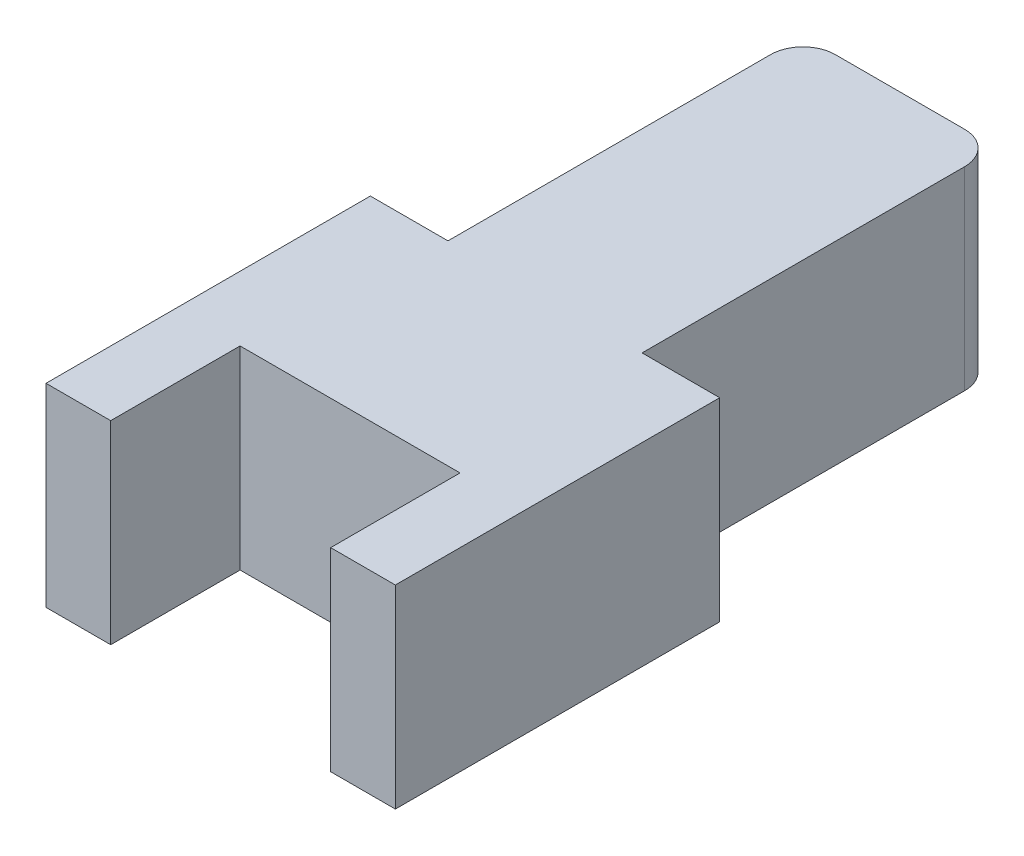
ISO-10303-21;
HEADER;
FILE_DESCRIPTION(('STEP AP214'),'2;1');
FILE_NAME('part.step','',(''),(''),'','','');
FILE_SCHEMA(('AUTOMOTIVE_DESIGN { 1 0 10303 214 1 1 1 1 }'));
ENDSEC;
DATA;
#1=APPLICATION_CONTEXT('core data for automotive mechanical design processes');
#2=APPLICATION_PROTOCOL_DEFINITION('international standard','automotive_design',2000,#1);
#3=PRODUCT_CONTEXT('',#1,'mechanical');
#4=PRODUCT('Part','Part','',(#3));
#5=PRODUCT_RELATED_PRODUCT_CATEGORY('part','',(#4));
#6=PRODUCT_DEFINITION_FORMATION('','',#4);
#7=PRODUCT_DEFINITION_CONTEXT('part definition',#1,'design');
#8=PRODUCT_DEFINITION('design','',#6,#7);
#9=PRODUCT_DEFINITION_SHAPE('','',#8);
#10=(LENGTH_UNIT() NAMED_UNIT(*) SI_UNIT(.MILLI.,.METRE.));
#11=(NAMED_UNIT(*) PLANE_ANGLE_UNIT() SI_UNIT($,.RADIAN.));
#12=(NAMED_UNIT(*) SI_UNIT($,.STERADIAN.) SOLID_ANGLE_UNIT());
#13=UNCERTAINTY_MEASURE_WITH_UNIT(LENGTH_MEASURE(1.E-05),#10,'distance_accuracy_value','');
#14=(GEOMETRIC_REPRESENTATION_CONTEXT(3) GLOBAL_UNCERTAINTY_ASSIGNED_CONTEXT((#13)) GLOBAL_UNIT_ASSIGNED_CONTEXT((#10,
#11,#12)) REPRESENTATION_CONTEXT('',''));
#15=CARTESIAN_POINT('',(0.,0.,0.));
#16=DIRECTION('',(0.,0.,1.));
#17=DIRECTION('',(1.,0.,0.));
#18=AXIS2_PLACEMENT_3D('',#15,#16,#17);
#19=CARTESIAN_POINT('',(15.4,4.94,0.));
#20=DIRECTION('',(1.,0.,0.));
#21=DIRECTION('',(0.,0.,-1.));
#22=AXIS2_PLACEMENT_3D('',#19,#20,#21);
#23=PLANE('',#22);
#24=DIRECTION('',(0.,0.,-1.));
#25=VECTOR('',#24,1.);
#26=CARTESIAN_POINT('',(15.4,7.94,0.));
#27=LINE('',#26,#25);
#28=CARTESIAN_POINT('',(15.4,7.94,-6.1));
#29=VERTEX_POINT('',#28);
#30=CARTESIAN_POINT('',(15.4,7.94,-11.113558159164));
#31=VERTEX_POINT('',#30);
#32=EDGE_CURVE('E161',#29,#31,#27,.T.);
#33=ORIENTED_EDGE('',*,*,#32,.T.);
#34=DIRECTION('',(0.,1.,0.));
#35=VECTOR('',#34,1.);
#36=CARTESIAN_POINT('',(15.4,4.94,-11.113558159164));
#37=LINE('',#36,#35);
#38=CARTESIAN_POINT('',(15.4,4.94,-11.113558159164));
#39=VERTEX_POINT('',#38);
#40=EDGE_CURVE('E142',#39,#31,#37,.T.);
#41=ORIENTED_EDGE('',*,*,#40,.F.);
#42=DIRECTION('',(0.,0.,-1.));
#43=VECTOR('',#42,1.);
#44=CARTESIAN_POINT('',(15.4,4.94,0.));
#45=LINE('',#44,#43);
#46=CARTESIAN_POINT('',(15.4,4.94,-6.1));
#47=VERTEX_POINT('',#46);
#48=EDGE_CURVE('E148',#47,#39,#45,.T.);
#49=ORIENTED_EDGE('',*,*,#48,.F.);
#50=DIRECTION('',(0.,1.,0.));
#51=VECTOR('',#50,1.);
#52=CARTESIAN_POINT('',(15.4,4.94,-6.1));
#53=LINE('',#52,#51);
#54=EDGE_CURVE('E226',#47,#29,#53,.T.);
#55=ORIENTED_EDGE('',*,*,#54,.T.);
#56=EDGE_LOOP('',(#33,#41,#49,#55));
#57=FACE_BOUND('',#56,.T.);
#58=ADVANCED_FACE('F34',(#57),#23,.F.);
#59=CARTESIAN_POINT('',(0.,4.94,-11.113558159164));
#60=DIRECTION('',(0.,0.,1.));
#61=DIRECTION('',(1.,0.,0.));
#62=AXIS2_PLACEMENT_3D('',#59,#60,#61);
#63=PLANE('',#62);
#64=DIRECTION('',(1.,0.,0.));
#65=VECTOR('',#64,1.);
#66=CARTESIAN_POINT('',(0.,7.94,-11.113558159164));
#67=LINE('',#66,#65);
#68=CARTESIAN_POINT('',(16.6,7.94,-11.113558159164));
#69=VERTEX_POINT('',#68);
#70=EDGE_CURVE('E205',#31,#69,#67,.T.);
#71=ORIENTED_EDGE('',*,*,#70,.T.);
#72=DIRECTION('',(0.,1.,0.));
#73=VECTOR('',#72,1.);
#74=CARTESIAN_POINT('',(16.6,4.94,-11.113558159164));
#75=LINE('',#74,#73);
#76=CARTESIAN_POINT('',(16.6,4.94,-11.113558159164));
#77=VERTEX_POINT('',#76);
#78=EDGE_CURVE('E145',#77,#69,#75,.T.);
#79=ORIENTED_EDGE('',*,*,#78,.F.);
#80=DIRECTION('',(1.,0.,0.));
#81=VECTOR('',#80,1.);
#82=CARTESIAN_POINT('',(0.,4.94,-11.113558159164));
#83=LINE('',#82,#81);
#84=EDGE_CURVE('E137',#39,#77,#83,.T.);
#85=ORIENTED_EDGE('',*,*,#84,.F.);
#86=ORIENTED_EDGE('',*,*,#40,.T.);
#87=EDGE_LOOP('',(#71,#79,#85,#86));
#88=FACE_BOUND('',#87,.T.);
#89=ADVANCED_FACE('F140',(#88),#63,.F.);
#90=CARTESIAN_POINT('',(16.6,4.94,0.));
#91=DIRECTION('',(-1.,0.,0.));
#92=DIRECTION('',(0.,0.,1.));
#93=AXIS2_PLACEMENT_3D('',#90,#91,#92);
#94=PLANE('',#93);
#95=DIRECTION('',(0.,0.,1.));
#96=VECTOR('',#95,1.);
#97=CARTESIAN_POINT('',(16.6,7.94,0.));
#98=LINE('',#97,#96);
#99=CARTESIAN_POINT('',(16.6,7.94,-16.1));
#100=VERTEX_POINT('',#99);
#101=EDGE_CURVE('E201',#100,#69,#98,.T.);
#102=ORIENTED_EDGE('',*,*,#101,.F.);
#103=DIRECTION('',(0.,1.,0.));
#104=VECTOR('',#103,1.);
#105=CARTESIAN_POINT('',(16.6,4.94,-16.1));
#106=LINE('',#105,#104);
#107=CARTESIAN_POINT('',(16.6,4.94,-16.1));
#108=VERTEX_POINT('',#107);
#109=EDGE_CURVE('E11',#100,#108,#106,.F.);
#110=ORIENTED_EDGE('',*,*,#109,.T.);
#111=DIRECTION('',(0.,0.,1.));
#112=VECTOR('',#111,1.);
#113=CARTESIAN_POINT('',(16.6,4.94,0.));
#114=LINE('',#113,#112);
#115=EDGE_CURVE('E147',#108,#77,#114,.T.);
#116=ORIENTED_EDGE('',*,*,#115,.T.);
#117=ORIENTED_EDGE('',*,*,#78,.T.);
#118=EDGE_LOOP('',(#102,#110,#116,#117));
#119=FACE_BOUND('',#118,.T.);
#120=ADVANCED_FACE('F263',(#119),#94,.T.);
#121=CARTESIAN_POINT('',(0.,4.94,-16.6));
#122=DIRECTION('',(0.,0.,1.));
#123=DIRECTION('',(1.,0.,0.));
#124=AXIS2_PLACEMENT_3D('',#121,#122,#123);
#125=PLANE('',#124);
#126=DIRECTION('',(1.,0.,0.));
#127=VECTOR('',#126,1.);
#128=CARTESIAN_POINT('',(0.,7.94,-16.6));
#129=LINE('',#128,#127);
#130=CARTESIAN_POINT('',(17.1,7.94,-16.6));
#131=VERTEX_POINT('',#130);
#132=CARTESIAN_POINT('',(19.1,7.94,-16.6));
#133=VERTEX_POINT('',#132);
#134=EDGE_CURVE('E196',#131,#133,#129,.T.);
#135=ORIENTED_EDGE('',*,*,#134,.T.);
#136=DIRECTION('',(0.,1.,0.));
#137=VECTOR('',#136,1.);
#138=CARTESIAN_POINT('',(19.1,4.94,-16.6));
#139=LINE('',#138,#137);
#140=CARTESIAN_POINT('',(19.1,4.94,-16.6));
#141=VERTEX_POINT('',#140);
#142=EDGE_CURVE('E55',#133,#141,#139,.F.);
#143=ORIENTED_EDGE('',*,*,#142,.T.);
#144=DIRECTION('',(1.,0.,0.));
#145=VECTOR('',#144,1.);
#146=CARTESIAN_POINT('',(0.,4.94,-16.6));
#147=LINE('',#146,#145);
#148=CARTESIAN_POINT('',(17.1,4.94,-16.6));
#149=VERTEX_POINT('',#148);
#150=EDGE_CURVE('E183',#149,#141,#147,.T.);
#151=ORIENTED_EDGE('',*,*,#150,.F.);
#152=DIRECTION('',(0.,1.,0.));
#153=VECTOR('',#152,1.);
#154=CARTESIAN_POINT('',(17.1,7.94,-16.6));
#155=LINE('',#154,#153);
#156=EDGE_CURVE('E174',#149,#131,#155,.T.);
#157=ORIENTED_EDGE('',*,*,#156,.T.);
#158=EDGE_LOOP('',(#135,#143,#151,#157));
#159=FACE_BOUND('',#158,.T.);
#160=ADVANCED_FACE('F199',(#159),#125,.F.);
#161=CARTESIAN_POINT('',(19.6,4.94,0.));
#162=DIRECTION('',(-1.,0.,0.));
#163=DIRECTION('',(0.,0.,1.));
#164=AXIS2_PLACEMENT_3D('',#161,#162,#163);
#165=PLANE('',#164);
#166=DIRECTION('',(0.,0.,1.));
#167=VECTOR('',#166,1.);
#168=CARTESIAN_POINT('',(19.6,4.94,0.));
#169=LINE('',#168,#167);
#170=CARTESIAN_POINT('',(19.6,4.94,-16.1));
#171=VERTEX_POINT('',#170);
#172=CARTESIAN_POINT('',(19.6,4.94,-11.113558159164));
#173=VERTEX_POINT('',#172);
#174=EDGE_CURVE('E181',#171,#173,#169,.T.);
#175=ORIENTED_EDGE('',*,*,#174,.F.);
#176=DIRECTION('',(0.,1.,0.));
#177=VECTOR('',#176,1.);
#178=CARTESIAN_POINT('',(19.6,4.94,-16.1));
#179=LINE('',#178,#177);
#180=CARTESIAN_POINT('',(19.6,7.94,-16.1));
#181=VERTEX_POINT('',#180);
#182=EDGE_CURVE('E162',#171,#181,#179,.T.);
#183=ORIENTED_EDGE('',*,*,#182,.T.);
#184=DIRECTION('',(0.,0.,1.));
#185=VECTOR('',#184,1.);
#186=CARTESIAN_POINT('',(19.6,7.94,0.));
#187=LINE('',#186,#185);
#188=CARTESIAN_POINT('',(19.6,7.94,-11.113558159164));
#189=VERTEX_POINT('',#188);
#190=EDGE_CURVE('E198',#181,#189,#187,.T.);
#191=ORIENTED_EDGE('',*,*,#190,.T.);
#192=DIRECTION('',(0.,1.,0.));
#193=VECTOR('',#192,1.);
#194=CARTESIAN_POINT('',(19.6,4.94,-11.113558159164));
#195=LINE('',#194,#193);
#196=EDGE_CURVE('E167',#173,#189,#195,.T.);
#197=ORIENTED_EDGE('',*,*,#196,.F.);
#198=EDGE_LOOP('',(#175,#183,#191,#197));
#199=FACE_BOUND('',#198,.T.);
#200=ADVANCED_FACE('F187',(#199),#165,.F.);
#201=CARTESIAN_POINT('',(20.8,7.94,-11.113558159164));
#202=VERTEX_POINT('',#201);
#203=EDGE_CURVE('E203',#189,#202,#67,.T.);
#204=ORIENTED_EDGE('',*,*,#203,.T.);
#205=DIRECTION('',(0.,1.,0.));
#206=VECTOR('',#205,1.);
#207=CARTESIAN_POINT('',(20.8,4.94,-11.113558159164));
#208=LINE('',#207,#206);
#209=CARTESIAN_POINT('',(20.8,4.94,-11.113558159164));
#210=VERTEX_POINT('',#209);
#211=EDGE_CURVE('E238',#210,#202,#208,.T.);
#212=ORIENTED_EDGE('',*,*,#211,.F.);
#213=EDGE_CURVE('E150',#173,#210,#83,.T.);
#214=ORIENTED_EDGE('',*,*,#213,.F.);
#215=ORIENTED_EDGE('',*,*,#196,.T.);
#216=EDGE_LOOP('',(#204,#212,#214,#215));
#217=FACE_BOUND('',#216,.T.);
#218=ADVANCED_FACE('F241',(#217),#63,.F.);
#219=CARTESIAN_POINT('',(20.8,4.94,0.));
#220=DIRECTION('',(1.,0.,0.));
#221=DIRECTION('',(0.,0.,-1.));
#222=AXIS2_PLACEMENT_3D('',#219,#220,#221);
#223=PLANE('',#222);
#224=DIRECTION('',(0.,0.,-1.));
#225=VECTOR('',#224,1.);
#226=CARTESIAN_POINT('',(20.8,7.94,0.));
#227=LINE('',#226,#225);
#228=CARTESIAN_POINT('',(20.8,7.94,-6.1));
#229=VERTEX_POINT('',#228);
#230=EDGE_CURVE('E209',#229,#202,#227,.T.);
#231=ORIENTED_EDGE('',*,*,#230,.F.);
#232=DIRECTION('',(0.,1.,0.));
#233=VECTOR('',#232,1.);
#234=CARTESIAN_POINT('',(20.8,4.94,-6.1));
#235=LINE('',#234,#233);
#236=CARTESIAN_POINT('',(20.8,4.94,-6.1));
#237=VERTEX_POINT('',#236);
#238=EDGE_CURVE('E236',#237,#229,#235,.T.);
#239=ORIENTED_EDGE('',*,*,#238,.F.);
#240=DIRECTION('',(0.,0.,-1.));
#241=VECTOR('',#240,1.);
#242=CARTESIAN_POINT('',(20.8,4.94,0.));
#243=LINE('',#242,#241);
#244=EDGE_CURVE('E259',#237,#210,#243,.T.);
#245=ORIENTED_EDGE('',*,*,#244,.T.);
#246=ORIENTED_EDGE('',*,*,#211,.T.);
#247=EDGE_LOOP('',(#231,#239,#245,#246));
#248=FACE_BOUND('',#247,.T.);
#249=ADVANCED_FACE('F286',(#248),#223,.T.);
#250=CARTESIAN_POINT('',(0.,4.94,-6.09999999999998));
#251=DIRECTION('',(0.,0.,1.));
#252=DIRECTION('',(1.,0.,0.));
#253=AXIS2_PLACEMENT_3D('',#250,#251,#252);
#254=PLANE('',#253);
#255=DIRECTION('',(1.,0.,0.));
#256=VECTOR('',#255,1.);
#257=CARTESIAN_POINT('',(0.,7.94,-6.09999999999998));
#258=LINE('',#257,#256);
#259=CARTESIAN_POINT('',(19.8,7.94,-6.1));
#260=VERTEX_POINT('',#259);
#261=EDGE_CURVE('E212',#260,#229,#258,.T.);
#262=ORIENTED_EDGE('',*,*,#261,.F.);
#263=DIRECTION('',(0.,1.,0.));
#264=VECTOR('',#263,1.);
#265=CARTESIAN_POINT('',(19.8,4.94,-6.1));
#266=LINE('',#265,#264);
#267=CARTESIAN_POINT('',(19.8,4.94,-6.1));
#268=VERTEX_POINT('',#267);
#269=EDGE_CURVE('E234',#268,#260,#266,.T.);
#270=ORIENTED_EDGE('',*,*,#269,.F.);
#271=DIRECTION('',(1.,0.,0.));
#272=VECTOR('',#271,1.);
#273=CARTESIAN_POINT('',(0.,4.94,-6.09999999999998));
#274=LINE('',#273,#272);
#275=EDGE_CURVE('E256',#268,#237,#274,.T.);
#276=ORIENTED_EDGE('',*,*,#275,.T.);
#277=ORIENTED_EDGE('',*,*,#238,.T.);
#278=EDGE_LOOP('',(#262,#270,#276,#277));
#279=FACE_BOUND('',#278,.T.);
#280=ADVANCED_FACE('F283',(#279),#254,.T.);
#281=CARTESIAN_POINT('',(19.8,4.94,0.));
#282=DIRECTION('',(-1.,0.,0.));
#283=DIRECTION('',(0.,0.,1.));
#284=AXIS2_PLACEMENT_3D('',#281,#282,#283);
#285=PLANE('',#284);
#286=DIRECTION('',(0.,0.,1.));
#287=VECTOR('',#286,1.);
#288=CARTESIAN_POINT('',(19.8,7.94,0.));
#289=LINE('',#288,#287);
#290=CARTESIAN_POINT('',(19.8,7.94,-8.1));
#291=VERTEX_POINT('',#290);
#292=EDGE_CURVE('E215',#291,#260,#289,.T.);
#293=ORIENTED_EDGE('',*,*,#292,.F.);
#294=DIRECTION('',(0.,1.,0.));
#295=VECTOR('',#294,1.);
#296=CARTESIAN_POINT('',(19.8,4.94,-8.1));
#297=LINE('',#296,#295);
#298=CARTESIAN_POINT('',(19.8,4.94,-8.1));
#299=VERTEX_POINT('',#298);
#300=EDGE_CURVE('E232',#299,#291,#297,.T.);
#301=ORIENTED_EDGE('',*,*,#300,.F.);
#302=DIRECTION('',(0.,0.,1.));
#303=VECTOR('',#302,1.);
#304=CARTESIAN_POINT('',(19.8,4.94,0.));
#305=LINE('',#304,#303);
#306=EDGE_CURVE('E253',#299,#268,#305,.T.);
#307=ORIENTED_EDGE('',*,*,#306,.T.);
#308=ORIENTED_EDGE('',*,*,#269,.T.);
#309=EDGE_LOOP('',(#293,#301,#307,#308));
#310=FACE_BOUND('',#309,.T.);
#311=ADVANCED_FACE('F279',(#310),#285,.T.);
#312=CARTESIAN_POINT('',(0.,4.94,-8.1));
#313=DIRECTION('',(0.,0.,1.));
#314=DIRECTION('',(1.,0.,0.));
#315=AXIS2_PLACEMENT_3D('',#312,#313,#314);
#316=PLANE('',#315);
#317=DIRECTION('',(1.,0.,0.));
#318=VECTOR('',#317,1.);
#319=CARTESIAN_POINT('',(0.,7.94,-8.1));
#320=LINE('',#319,#318);
#321=CARTESIAN_POINT('',(16.4,7.94,-8.1));
#322=VERTEX_POINT('',#321);
#323=EDGE_CURVE('E218',#322,#291,#320,.T.);
#324=ORIENTED_EDGE('',*,*,#323,.F.);
#325=DIRECTION('',(0.,1.,0.));
#326=VECTOR('',#325,1.);
#327=CARTESIAN_POINT('',(16.4,4.94,-8.1));
#328=LINE('',#327,#326);
#329=CARTESIAN_POINT('',(16.4,4.94,-8.1));
#330=VERTEX_POINT('',#329);
#331=EDGE_CURVE('E230',#330,#322,#328,.T.);
#332=ORIENTED_EDGE('',*,*,#331,.F.);
#333=DIRECTION('',(1.,0.,0.));
#334=VECTOR('',#333,1.);
#335=CARTESIAN_POINT('',(0.,4.94,-8.1));
#336=LINE('',#335,#334);
#337=EDGE_CURVE('E250',#330,#299,#336,.T.);
#338=ORIENTED_EDGE('',*,*,#337,.T.);
#339=ORIENTED_EDGE('',*,*,#300,.T.);
#340=EDGE_LOOP('',(#324,#332,#338,#339));
#341=FACE_BOUND('',#340,.T.);
#342=ADVANCED_FACE('F275',(#341),#316,.T.);
#343=CARTESIAN_POINT('',(16.4,4.94,0.));
#344=DIRECTION('',(1.,0.,0.));
#345=DIRECTION('',(0.,0.,-1.));
#346=AXIS2_PLACEMENT_3D('',#343,#344,#345);
#347=PLANE('',#346);
#348=DIRECTION('',(0.,0.,-1.));
#349=VECTOR('',#348,1.);
#350=CARTESIAN_POINT('',(16.4,7.94,0.));
#351=LINE('',#350,#349);
#352=CARTESIAN_POINT('',(16.4,7.94,-6.1));
#353=VERTEX_POINT('',#352);
#354=EDGE_CURVE('E221',#353,#322,#351,.T.);
#355=ORIENTED_EDGE('',*,*,#354,.F.);
#356=DIRECTION('',(0.,1.,0.));
#357=VECTOR('',#356,1.);
#358=CARTESIAN_POINT('',(16.4,4.94,-6.1));
#359=LINE('',#358,#357);
#360=CARTESIAN_POINT('',(16.4,4.94,-6.1));
#361=VERTEX_POINT('',#360);
#362=EDGE_CURVE('E228',#361,#353,#359,.T.);
#363=ORIENTED_EDGE('',*,*,#362,.F.);
#364=DIRECTION('',(0.,0.,-1.));
#365=VECTOR('',#364,1.);
#366=CARTESIAN_POINT('',(16.4,4.94,0.));
#367=LINE('',#366,#365);
#368=EDGE_CURVE('E247',#361,#330,#367,.T.);
#369=ORIENTED_EDGE('',*,*,#368,.T.);
#370=ORIENTED_EDGE('',*,*,#331,.T.);
#371=EDGE_LOOP('',(#355,#363,#369,#370));
#372=FACE_BOUND('',#371,.T.);
#373=ADVANCED_FACE('F271',(#372),#347,.T.);
#374=CARTESIAN_POINT('',(0.,4.94,-6.10000000000001));
#375=DIRECTION('',(0.,0.,1.));
#376=DIRECTION('',(1.,0.,0.));
#377=AXIS2_PLACEMENT_3D('',#374,#375,#376);
#378=PLANE('',#377);
#379=DIRECTION('',(1.,0.,0.));
#380=VECTOR('',#379,1.);
#381=CARTESIAN_POINT('',(0.,7.94,-6.10000000000001));
#382=LINE('',#381,#380);
#383=EDGE_CURVE('E158',#29,#353,#382,.T.);
#384=ORIENTED_EDGE('',*,*,#383,.F.);
#385=ORIENTED_EDGE('',*,*,#54,.F.);
#386=DIRECTION('',(1.,0.,0.));
#387=VECTOR('',#386,1.);
#388=CARTESIAN_POINT('',(0.,4.94,-6.10000000000001));
#389=LINE('',#388,#387);
#390=EDGE_CURVE('E156',#47,#361,#389,.T.);
#391=ORIENTED_EDGE('',*,*,#390,.T.);
#392=ORIENTED_EDGE('',*,*,#362,.T.);
#393=EDGE_LOOP('',(#384,#385,#391,#392));
#394=FACE_BOUND('',#393,.T.);
#395=ADVANCED_FACE('F268',(#394),#378,.T.);
#396=CARTESIAN_POINT('',(0.,4.94,0.));
#397=DIRECTION('',(0.,-1.,0.));
#398=DIRECTION('',(0.,0.,-1.));
#399=AXIS2_PLACEMENT_3D('',#396,#397,#398);
#400=PLANE('',#399);
#401=ORIENTED_EDGE('',*,*,#150,.T.);
#402=CARTESIAN_POINT('',(19.1,4.94,-16.1));
#403=DIRECTION('',(0.,-1.,0.));
#404=DIRECTION('',(0.,0.,-1.));
#405=AXIS2_PLACEMENT_3D('',#402,#403,#404);
#406=CIRCLE('',#405,0.5);
#407=EDGE_CURVE('E42',#141,#171,#406,.T.);
#408=ORIENTED_EDGE('',*,*,#407,.T.);
#409=ORIENTED_EDGE('',*,*,#174,.T.);
#410=ORIENTED_EDGE('',*,*,#213,.T.);
#411=ORIENTED_EDGE('',*,*,#244,.F.);
#412=ORIENTED_EDGE('',*,*,#275,.F.);
#413=ORIENTED_EDGE('',*,*,#306,.F.);
#414=ORIENTED_EDGE('',*,*,#337,.F.);
#415=ORIENTED_EDGE('',*,*,#368,.F.);
#416=ORIENTED_EDGE('',*,*,#390,.F.);
#417=ORIENTED_EDGE('',*,*,#48,.T.);
#418=ORIENTED_EDGE('',*,*,#84,.T.);
#419=ORIENTED_EDGE('',*,*,#115,.F.);
#420=CARTESIAN_POINT('',(17.1,4.94,-16.1));
#421=DIRECTION('',(0.,-1.,0.));
#422=DIRECTION('',(0.,0.,-1.));
#423=AXIS2_PLACEMENT_3D('',#420,#421,#422);
#424=CIRCLE('',#423,0.5);
#425=EDGE_CURVE('E178',#108,#149,#424,.T.);
#426=ORIENTED_EDGE('',*,*,#425,.T.);
#427=EDGE_LOOP('',(#401,#408,#409,#410,#411,#412,#413,#414,#415,#416,#417,#418,#419,#426));
#428=FACE_BOUND('',#427,.T.);
#429=ADVANCED_FACE('F153',(#428),#400,.T.);
#430=CARTESIAN_POINT('',(0.,7.94,0.));
#431=DIRECTION('',(0.,-1.,0.));
#432=DIRECTION('',(0.,0.,-1.));
#433=AXIS2_PLACEMENT_3D('',#430,#431,#432);
#434=PLANE('',#433);
#435=ORIENTED_EDGE('',*,*,#190,.F.);
#436=CARTESIAN_POINT('',(19.1,7.94,-16.1));
#437=DIRECTION('',(0.,-1.,0.));
#438=DIRECTION('',(0.,0.,-1.));
#439=AXIS2_PLACEMENT_3D('',#436,#437,#438);
#440=CIRCLE('',#439,0.5);
#441=EDGE_CURVE('E172',#181,#133,#440,.F.);
#442=ORIENTED_EDGE('',*,*,#441,.T.);
#443=ORIENTED_EDGE('',*,*,#134,.F.);
#444=CARTESIAN_POINT('',(17.1,7.94,-16.1));
#445=DIRECTION('',(0.,-1.,0.));
#446=DIRECTION('',(0.,0.,-1.));
#447=AXIS2_PLACEMENT_3D('',#444,#445,#446);
#448=CIRCLE('',#447,0.5);
#449=EDGE_CURVE('E165',#131,#100,#448,.F.);
#450=ORIENTED_EDGE('',*,*,#449,.T.);
#451=ORIENTED_EDGE('',*,*,#101,.T.);
#452=ORIENTED_EDGE('',*,*,#70,.F.);
#453=ORIENTED_EDGE('',*,*,#32,.F.);
#454=ORIENTED_EDGE('',*,*,#383,.T.);
#455=ORIENTED_EDGE('',*,*,#354,.T.);
#456=ORIENTED_EDGE('',*,*,#323,.T.);
#457=ORIENTED_EDGE('',*,*,#292,.T.);
#458=ORIENTED_EDGE('',*,*,#261,.T.);
#459=ORIENTED_EDGE('',*,*,#230,.T.);
#460=ORIENTED_EDGE('',*,*,#203,.F.);
#461=EDGE_LOOP('',(#435,#442,#443,#450,#451,#452,#453,#454,#455,#456,#457,#458,#459,#460));
#462=FACE_BOUND('',#461,.T.);
#463=ADVANCED_FACE('F195',(#462),#434,.F.);
#464=CARTESIAN_POINT('',(19.1,4.94,-16.1));
#465=DIRECTION('',(0.,1.,0.));
#466=DIRECTION('',(0.,0.,1.));
#467=AXIS2_PLACEMENT_3D('',#464,#465,#466);
#468=CYLINDRICAL_SURFACE('',#467,0.5);
#469=ORIENTED_EDGE('',*,*,#407,.F.);
#470=ORIENTED_EDGE('',*,*,#142,.F.);
#471=ORIENTED_EDGE('',*,*,#441,.F.);
#472=ORIENTED_EDGE('',*,*,#182,.F.);
#473=EDGE_LOOP('',(#469,#470,#471,#472));
#474=FACE_BOUND('',#473,.T.);
#475=ADVANCED_FACE('F192',(#474),#468,.T.);
#476=CARTESIAN_POINT('',(17.1,4.94,-16.1));
#477=DIRECTION('',(0.,-1.,0.));
#478=DIRECTION('',(0.,0.,-1.));
#479=AXIS2_PLACEMENT_3D('',#476,#477,#478);
#480=CYLINDRICAL_SURFACE('',#479,0.5);
#481=ORIENTED_EDGE('',*,*,#425,.F.);
#482=ORIENTED_EDGE('',*,*,#109,.F.);
#483=ORIENTED_EDGE('',*,*,#449,.F.);
#484=ORIENTED_EDGE('',*,*,#156,.F.);
#485=EDGE_LOOP('',(#481,#482,#483,#484));
#486=FACE_BOUND('',#485,.T.);
#487=ADVANCED_FACE('F36',(#486),#480,.T.);
#488=CLOSED_SHELL('',(#58,#89,#120,#160,#200,#218,#249,#280,#311,#342,#373,#395,#429,#463,#475,#487));
#489=MANIFOLD_SOLID_BREP('B2',#488);
#490=ADVANCED_BREP_SHAPE_REPRESENTATION('',(#18,#489),#14);
#491=SHAPE_DEFINITION_REPRESENTATION(#9,#490);
ENDSEC;
END-ISO-10303-21;
